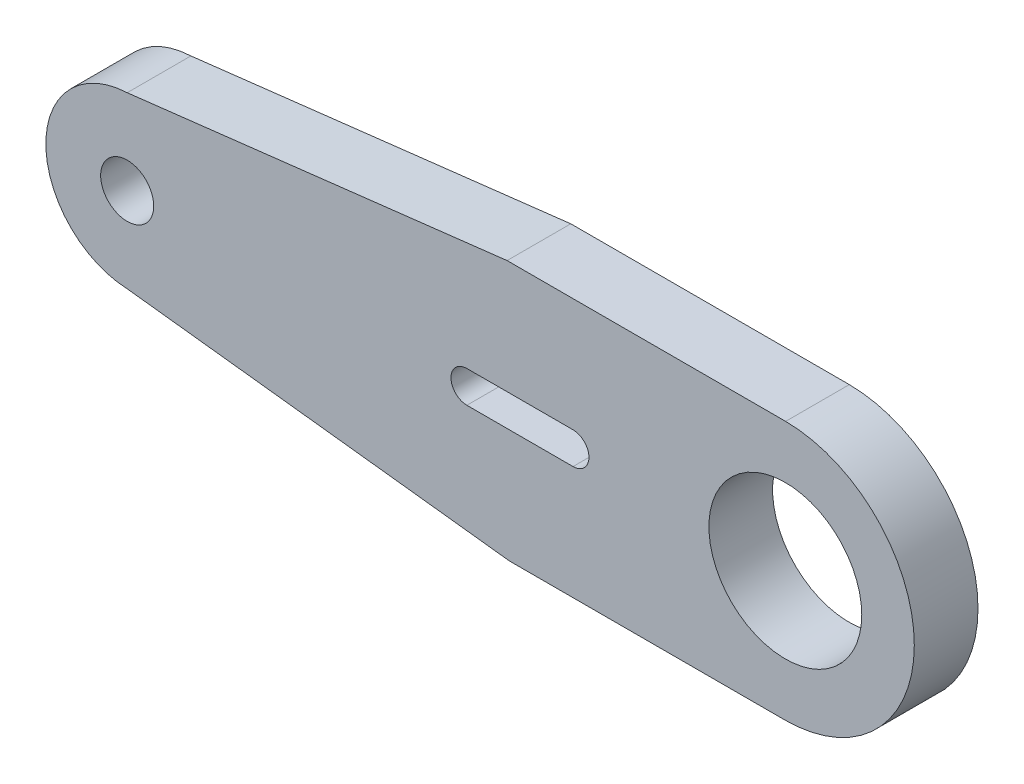
ISO-10303-21;
HEADER;
FILE_DESCRIPTION(('STEP AP214'),'2;1');
FILE_NAME('part.step','',(''),(''),'','','');
FILE_SCHEMA(('AUTOMOTIVE_DESIGN { 1 0 10303 214 1 1 1 1 }'));
ENDSEC;
DATA;
#1=APPLICATION_CONTEXT('core data for automotive mechanical design processes');
#2=APPLICATION_PROTOCOL_DEFINITION('international standard','automotive_design',2000,#1);
#3=PRODUCT_CONTEXT('',#1,'mechanical');
#4=PRODUCT('Part','Part','',(#3));
#5=PRODUCT_RELATED_PRODUCT_CATEGORY('part','',(#4));
#6=PRODUCT_DEFINITION_FORMATION('','',#4);
#7=PRODUCT_DEFINITION_CONTEXT('part definition',#1,'design');
#8=PRODUCT_DEFINITION('design','',#6,#7);
#9=PRODUCT_DEFINITION_SHAPE('','',#8);
#10=(LENGTH_UNIT() NAMED_UNIT(*) SI_UNIT(.MILLI.,.METRE.));
#11=(NAMED_UNIT(*) PLANE_ANGLE_UNIT() SI_UNIT($,.RADIAN.));
#12=(NAMED_UNIT(*) SI_UNIT($,.STERADIAN.) SOLID_ANGLE_UNIT());
#13=UNCERTAINTY_MEASURE_WITH_UNIT(LENGTH_MEASURE(1.E-05),#10,'distance_accuracy_value','');
#14=(GEOMETRIC_REPRESENTATION_CONTEXT(3) GLOBAL_UNCERTAINTY_ASSIGNED_CONTEXT((#13)) GLOBAL_UNIT_ASSIGNED_CONTEXT((#10,
#11,#12)) REPRESENTATION_CONTEXT('',''));
#15=CARTESIAN_POINT('',(0.,0.,0.));
#16=DIRECTION('',(0.,0.,1.));
#17=DIRECTION('',(1.,0.,0.));
#18=AXIS2_PLACEMENT_3D('',#15,#16,#17);
#19=CARTESIAN_POINT('',(266.899778036359,64.0873224153859,3.));
#20=DIRECTION('',(0.,0.,1.));
#21=DIRECTION('',(1.,0.,0.));
#22=AXIS2_PLACEMENT_3D('',#19,#20,#21);
#23=PLANE('',#22);
#24=CARTESIAN_POINT('',(235.924992032314,64.0869474524909,3.));
#25=DIRECTION('',(0.,0.,1.));
#26=DIRECTION('',(1.,0.,0.));
#27=AXIS2_PLACEMENT_3D('',#24,#25,#26);
#28=CIRCLE('',#27,1.25000000000001);
#29=CARTESIAN_POINT('',(237.174992032314,64.0869474524909,3.));
#30=VERTEX_POINT('',#29);
#31=EDGE_CURVE('E138',#30,#30,#28,.T.);
#32=ORIENTED_EDGE('',*,*,#31,.F.);
#33=EDGE_LOOP('',(#32));
#34=FACE_BOUND('',#33,.T.);
#35=CARTESIAN_POINT('',(266.899778036359,64.0873224153859,3.));
#36=DIRECTION('',(0.,0.,1.));
#37=DIRECTION('',(1.,0.,0.));
#38=AXIS2_PLACEMENT_3D('',#35,#36,#37);
#39=CIRCLE('',#38,6.10042666391841);
#40=CARTESIAN_POINT('',(266.924893647648,57.9869474524909,3.));
#41=VERTEX_POINT('',#40);
#42=CARTESIAN_POINT('',(266.940039040523,70.1876162225226,3.));
#43=VERTEX_POINT('',#42);
#44=EDGE_CURVE('E148',#41,#43,#39,.T.);
#45=ORIENTED_EDGE('',*,*,#44,.T.);
#46=DIRECTION('',(-0.999999998701056,-5.09694894962012E-05,0.));
#47=VECTOR('',#46,1.);
#48=CARTESIAN_POINT('',(266.940039040523,70.1876162225226,3.));
#49=LINE('',#48,#47);
#50=CARTESIAN_POINT('',(253.819051615869,70.186947452491,3.));
#51=VERTEX_POINT('',#50);
#52=EDGE_CURVE('E151',#43,#51,#49,.T.);
#53=ORIENTED_EDGE('',*,*,#52,.T.);
#54=DIRECTION('',(-0.993183948949828,-0.116557468865904,0.));
#55=VECTOR('',#54,1.);
#56=CARTESIAN_POINT('',(253.819051615869,70.186947452491,3.));
#57=LINE('',#56,#55);
#58=CARTESIAN_POINT('',(235.924992032314,68.0869474524908,3.));
#59=VERTEX_POINT('',#58);
#60=EDGE_CURVE('E154',#51,#59,#57,.T.);
#61=ORIENTED_EDGE('',*,*,#60,.T.);
#62=CARTESIAN_POINT('',(236.096696802075,64.0869474524906,3.));
#63=DIRECTION('',(0.,0.,1.));
#64=DIRECTION('',(1.,0.,0.));
#65=AXIS2_PLACEMENT_3D('',#62,#63,#64);
#66=CIRCLE('',#65,4.00368361986314);
#67=CARTESIAN_POINT('',(235.924992032314,60.0869474524904,3.));
#68=VERTEX_POINT('',#67);
#69=EDGE_CURVE('E156',#59,#68,#66,.T.);
#70=ORIENTED_EDGE('',*,*,#69,.T.);
#71=DIRECTION('',(0.99326306618432,-0.115881324440666,0.));
#72=VECTOR('',#71,1.);
#73=CARTESIAN_POINT('',(235.924992032314,60.0869474524904,3.));
#74=LINE('',#73,#72);
#75=CARTESIAN_POINT('',(253.924893647648,57.9869474524909,3.));
#76=VERTEX_POINT('',#75);
#77=EDGE_CURVE('E158',#68,#76,#74,.T.);
#78=ORIENTED_EDGE('',*,*,#77,.T.);
#79=DIRECTION('',(1.,0.,0.));
#80=VECTOR('',#79,1.);
#81=CARTESIAN_POINT('',(253.924893647648,57.9869474524909,3.));
#82=LINE('',#81,#80);
#83=EDGE_CURVE('E160',#76,#41,#82,.T.);
#84=ORIENTED_EDGE('',*,*,#83,.T.);
#85=EDGE_LOOP('',(#45,#53,#61,#70,#78,#84));
#86=FACE_BOUND('',#85,.T.);
#87=DIRECTION('',(1.,3.32767569985373E-10,0.));
#88=VECTOR('',#87,1.);
#89=CARTESIAN_POINT('',(256.9249089259,63.3369474562414,3.));
#90=LINE('',#89,#88);
#91=CARTESIAN_POINT('',(251.9249152789,63.3369474545775,3.));
#92=VERTEX_POINT('',#91);
#93=CARTESIAN_POINT('',(256.9249089259,63.3369474562414,3.));
#94=VERTEX_POINT('',#93);
#95=EDGE_CURVE('E117',#92,#94,#90,.T.);
#96=ORIENTED_EDGE('',*,*,#95,.F.);
#97=CARTESIAN_POINT('',(251.9249152789,64.086947452491,3.));
#98=DIRECTION('',(0.,0.,1.));
#99=DIRECTION('',(1.,0.,0.));
#100=AXIS2_PLACEMENT_3D('',#97,#98,#99);
#101=CIRCLE('',#100,0.749999997913448);
#102=CARTESIAN_POINT('',(251.9249152789,64.8369474504044,3.));
#103=VERTEX_POINT('',#102);
#104=EDGE_CURVE('E109',#103,#92,#101,.T.);
#105=ORIENTED_EDGE('',*,*,#104,.F.);
#106=DIRECTION('',(-1.,0.,0.));
#107=VECTOR('',#106,1.);
#108=CARTESIAN_POINT('',(251.9249152789,64.8369474504044,3.));
#109=LINE('',#108,#107);
#110=CARTESIAN_POINT('',(256.924908925901,64.8369474504044,3.));
#111=VERTEX_POINT('',#110);
#112=EDGE_CURVE('E132',#111,#103,#109,.T.);
#113=ORIENTED_EDGE('',*,*,#112,.F.);
#114=CARTESIAN_POINT('',(256.9249089259,64.0869474533229,3.));
#115=DIRECTION('',(0.,0.,1.));
#116=DIRECTION('',(1.,0.,0.));
#117=AXIS2_PLACEMENT_3D('',#114,#115,#116);
#118=CIRCLE('',#117,0.74999999708153);
#119=EDGE_CURVE('E130',#94,#111,#118,.T.);
#120=ORIENTED_EDGE('',*,*,#119,.F.);
#121=EDGE_LOOP('',(#96,#105,#113,#120));
#122=FACE_BOUND('',#121,.T.);
#123=CARTESIAN_POINT('',(266.924883927151,64.0869974524909,3.));
#124=DIRECTION('',(0.,0.,1.));
#125=DIRECTION('',(1.,0.,0.));
#126=AXIS2_PLACEMENT_3D('',#123,#124,#125);
#127=CIRCLE('',#126,3.60000000000001);
#128=CARTESIAN_POINT('',(270.524883927151,64.0869974524909,3.));
#129=VERTEX_POINT('',#128);
#130=EDGE_CURVE('E254',#129,#129,#127,.T.);
#131=ORIENTED_EDGE('',*,*,#130,.F.);
#132=EDGE_LOOP('',(#131));
#133=FACE_BOUND('',#132,.T.);
#134=ADVANCED_FACE('F32',(#34,#86,#122,#133),#23,.T.);
#135=CARTESIAN_POINT('',(266.899778036359,64.0873224153859,0.));
#136=DIRECTION('',(0.,0.,1.));
#137=DIRECTION('',(1.,0.,0.));
#138=AXIS2_PLACEMENT_3D('',#135,#136,#137);
#139=PLANE('',#138);
#140=CARTESIAN_POINT('',(266.899778036359,64.0873224153859,0.));
#141=DIRECTION('',(0.,0.,1.));
#142=DIRECTION('',(1.,0.,0.));
#143=AXIS2_PLACEMENT_3D('',#140,#141,#142);
#144=CIRCLE('',#143,6.10042666391841);
#145=CARTESIAN_POINT('',(266.924893647648,57.9869474524909,0.));
#146=VERTEX_POINT('',#145);
#147=CARTESIAN_POINT('',(266.940039040523,70.1876162225226,0.));
#148=VERTEX_POINT('',#147);
#149=EDGE_CURVE('E125',#146,#148,#144,.T.);
#150=ORIENTED_EDGE('',*,*,#149,.F.);
#151=DIRECTION('',(1.,0.,0.));
#152=VECTOR('',#151,1.);
#153=CARTESIAN_POINT('',(253.924893647648,57.9869474524909,0.));
#154=LINE('',#153,#152);
#155=CARTESIAN_POINT('',(253.924893647648,57.9869474524909,0.));
#156=VERTEX_POINT('',#155);
#157=EDGE_CURVE('E152',#156,#146,#154,.T.);
#158=ORIENTED_EDGE('',*,*,#157,.F.);
#159=DIRECTION('',(0.99326306618432,-0.115881324440666,0.));
#160=VECTOR('',#159,1.);
#161=CARTESIAN_POINT('',(235.924992032314,60.0869474524904,0.));
#162=LINE('',#161,#160);
#163=CARTESIAN_POINT('',(235.924992032314,60.0869474524904,0.));
#164=VERTEX_POINT('',#163);
#165=EDGE_CURVE('E171',#164,#156,#162,.T.);
#166=ORIENTED_EDGE('',*,*,#165,.F.);
#167=CARTESIAN_POINT('',(236.096696802075,64.0869474524906,0.));
#168=DIRECTION('',(0.,0.,1.));
#169=DIRECTION('',(1.,0.,0.));
#170=AXIS2_PLACEMENT_3D('',#167,#168,#169);
#171=CIRCLE('',#170,4.00368361986314);
#172=CARTESIAN_POINT('',(235.924992032314,68.0869474524908,0.));
#173=VERTEX_POINT('',#172);
#174=EDGE_CURVE('E169',#173,#164,#171,.T.);
#175=ORIENTED_EDGE('',*,*,#174,.F.);
#176=DIRECTION('',(-0.993183948949828,-0.116557468865904,0.));
#177=VECTOR('',#176,1.);
#178=CARTESIAN_POINT('',(253.819051615869,70.186947452491,0.));
#179=LINE('',#178,#177);
#180=CARTESIAN_POINT('',(253.819051615869,70.186947452491,0.));
#181=VERTEX_POINT('',#180);
#182=EDGE_CURVE('E167',#181,#173,#179,.T.);
#183=ORIENTED_EDGE('',*,*,#182,.F.);
#184=DIRECTION('',(-0.999999998701056,-5.09694894962012E-05,0.));
#185=VECTOR('',#184,1.);
#186=CARTESIAN_POINT('',(266.940039040523,70.1876162225226,0.));
#187=LINE('',#186,#185);
#188=EDGE_CURVE('E165',#148,#181,#187,.T.);
#189=ORIENTED_EDGE('',*,*,#188,.F.);
#190=EDGE_LOOP('',(#150,#158,#166,#175,#183,#189));
#191=FACE_BOUND('',#190,.T.);
#192=CARTESIAN_POINT('',(251.9249152789,64.086947452491,0.));
#193=DIRECTION('',(0.,0.,1.));
#194=DIRECTION('',(1.,0.,0.));
#195=AXIS2_PLACEMENT_3D('',#192,#193,#194);
#196=CIRCLE('',#195,0.749999997913448);
#197=CARTESIAN_POINT('',(251.9249152789,64.8369474504044,0.));
#198=VERTEX_POINT('',#197);
#199=CARTESIAN_POINT('',(251.9249152789,63.3369474545775,0.));
#200=VERTEX_POINT('',#199);
#201=EDGE_CURVE('E55',#198,#200,#196,.T.);
#202=ORIENTED_EDGE('',*,*,#201,.T.);
#203=DIRECTION('',(1.,3.32767569985373E-10,0.));
#204=VECTOR('',#203,1.);
#205=CARTESIAN_POINT('',(256.9249089259,63.3369474562414,0.));
#206=LINE('',#205,#204);
#207=CARTESIAN_POINT('',(256.9249089259,63.3369474562414,0.));
#208=VERTEX_POINT('',#207);
#209=EDGE_CURVE('E124',#200,#208,#206,.T.);
#210=ORIENTED_EDGE('',*,*,#209,.T.);
#211=CARTESIAN_POINT('',(256.9249089259,64.0869474533229,0.));
#212=DIRECTION('',(0.,0.,1.));
#213=DIRECTION('',(1.,0.,0.));
#214=AXIS2_PLACEMENT_3D('',#211,#212,#213);
#215=CIRCLE('',#214,0.74999999708153);
#216=CARTESIAN_POINT('',(256.924908925901,64.8369474504044,0.));
#217=VERTEX_POINT('',#216);
#218=EDGE_CURVE('E140',#208,#217,#215,.T.);
#219=ORIENTED_EDGE('',*,*,#218,.T.);
#220=DIRECTION('',(-1.,0.,0.));
#221=VECTOR('',#220,1.);
#222=CARTESIAN_POINT('',(251.9249152789,64.8369474504044,0.));
#223=LINE('',#222,#221);
#224=EDGE_CURVE('E118',#217,#198,#223,.T.);
#225=ORIENTED_EDGE('',*,*,#224,.T.);
#226=EDGE_LOOP('',(#202,#210,#219,#225));
#227=FACE_BOUND('',#226,.T.);
#228=CARTESIAN_POINT('',(235.924992032314,64.0869474524909,0.));
#229=DIRECTION('',(0.,0.,1.));
#230=DIRECTION('',(1.,0.,0.));
#231=AXIS2_PLACEMENT_3D('',#228,#229,#230);
#232=CIRCLE('',#231,1.25000000000001);
#233=CARTESIAN_POINT('',(237.174992032314,64.0869474524909,0.));
#234=VERTEX_POINT('',#233);
#235=EDGE_CURVE('E260',#234,#234,#232,.T.);
#236=ORIENTED_EDGE('',*,*,#235,.T.);
#237=EDGE_LOOP('',(#236));
#238=FACE_BOUND('',#237,.T.);
#239=CARTESIAN_POINT('',(266.924883927151,64.0869974524909,0.));
#240=DIRECTION('',(0.,0.,1.));
#241=DIRECTION('',(1.,0.,0.));
#242=AXIS2_PLACEMENT_3D('',#239,#240,#241);
#243=CIRCLE('',#242,3.60000000000001);
#244=CARTESIAN_POINT('',(270.524883927151,64.0869974524909,0.));
#245=VERTEX_POINT('',#244);
#246=EDGE_CURVE('E257',#245,#245,#243,.T.);
#247=ORIENTED_EDGE('',*,*,#246,.T.);
#248=EDGE_LOOP('',(#247));
#249=FACE_BOUND('',#248,.T.);
#250=ADVANCED_FACE('F195',(#191,#227,#238,#249),#139,.F.);
#251=CARTESIAN_POINT('',(266.899778036359,64.0873224153859,3.));
#252=DIRECTION('',(0.,0.,-1.));
#253=DIRECTION('',(-1.,0.,0.));
#254=AXIS2_PLACEMENT_3D('',#251,#252,#253);
#255=CYLINDRICAL_SURFACE('',#254,6.10042666391841);
#256=ORIENTED_EDGE('',*,*,#149,.T.);
#257=DIRECTION('',(0.,0.,-1.));
#258=VECTOR('',#257,1.);
#259=CARTESIAN_POINT('',(266.940039040523,70.1876162225226,3.));
#260=LINE('',#259,#258);
#261=EDGE_CURVE('E11',#43,#148,#260,.T.);
#262=ORIENTED_EDGE('',*,*,#261,.F.);
#263=ORIENTED_EDGE('',*,*,#44,.F.);
#264=DIRECTION('',(0.,0.,-1.));
#265=VECTOR('',#264,1.);
#266=CARTESIAN_POINT('',(266.924893647648,57.9869474524909,3.));
#267=LINE('',#266,#265);
#268=EDGE_CURVE('E162',#41,#146,#267,.T.);
#269=ORIENTED_EDGE('',*,*,#268,.T.);
#270=EDGE_LOOP('',(#256,#262,#263,#269));
#271=FACE_BOUND('',#270,.T.);
#272=ADVANCED_FACE('F34',(#271),#255,.T.);
#273=CARTESIAN_POINT('',(266.940039040523,70.1876162225226,3.));
#274=DIRECTION('',(5.09694894962012E-05,-0.999999998701055,0.));
#275=DIRECTION('',(0.999999998701056,5.09694894962012E-05,0.));
#276=AXIS2_PLACEMENT_3D('',#273,#274,#275);
#277=PLANE('',#276);
#278=ORIENTED_EDGE('',*,*,#188,.T.);
#279=DIRECTION('',(0.,0.,-1.));
#280=VECTOR('',#279,1.);
#281=CARTESIAN_POINT('',(253.819051615869,70.186947452491,3.));
#282=LINE('',#281,#280);
#283=EDGE_CURVE('E40',#51,#181,#282,.T.);
#284=ORIENTED_EDGE('',*,*,#283,.F.);
#285=ORIENTED_EDGE('',*,*,#52,.F.);
#286=ORIENTED_EDGE('',*,*,#261,.T.);
#287=EDGE_LOOP('',(#278,#284,#285,#286));
#288=FACE_BOUND('',#287,.T.);
#289=ADVANCED_FACE('F212',(#288),#277,.F.);
#290=CARTESIAN_POINT('',(253.819051615869,70.186947452491,3.));
#291=DIRECTION('',(0.116557468865904,-0.993183948949828,0.));
#292=DIRECTION('',(0.993183948949828,0.116557468865904,0.));
#293=AXIS2_PLACEMENT_3D('',#290,#291,#292);
#294=PLANE('',#293);
#295=ORIENTED_EDGE('',*,*,#182,.T.);
#296=DIRECTION('',(0.,0.,-1.));
#297=VECTOR('',#296,1.);
#298=CARTESIAN_POINT('',(235.924992032314,68.0869474524908,3.));
#299=LINE('',#298,#297);
#300=EDGE_CURVE('E182',#59,#173,#299,.T.);
#301=ORIENTED_EDGE('',*,*,#300,.F.);
#302=ORIENTED_EDGE('',*,*,#60,.F.);
#303=ORIENTED_EDGE('',*,*,#283,.T.);
#304=EDGE_LOOP('',(#295,#301,#302,#303));
#305=FACE_BOUND('',#304,.T.);
#306=ADVANCED_FACE('F189',(#305),#294,.F.);
#307=CARTESIAN_POINT('',(236.096696802075,64.0869474524906,3.));
#308=DIRECTION('',(0.,0.,-1.));
#309=DIRECTION('',(-1.,0.,0.));
#310=AXIS2_PLACEMENT_3D('',#307,#308,#309);
#311=CYLINDRICAL_SURFACE('',#310,4.00368361986314);
#312=ORIENTED_EDGE('',*,*,#174,.T.);
#313=DIRECTION('',(0.,0.,-1.));
#314=VECTOR('',#313,1.);
#315=CARTESIAN_POINT('',(235.924992032314,60.0869474524904,3.));
#316=LINE('',#315,#314);
#317=EDGE_CURVE('E179',#68,#164,#316,.T.);
#318=ORIENTED_EDGE('',*,*,#317,.F.);
#319=ORIENTED_EDGE('',*,*,#69,.F.);
#320=ORIENTED_EDGE('',*,*,#300,.T.);
#321=EDGE_LOOP('',(#312,#318,#319,#320));
#322=FACE_BOUND('',#321,.T.);
#323=ADVANCED_FACE('F201',(#322),#311,.T.);
#324=CARTESIAN_POINT('',(235.924992032314,60.0869474524904,3.));
#325=DIRECTION('',(0.115881324440666,0.99326306618432,0.));
#326=DIRECTION('',(-0.99326306618432,0.115881324440666,0.));
#327=AXIS2_PLACEMENT_3D('',#324,#325,#326);
#328=PLANE('',#327);
#329=ORIENTED_EDGE('',*,*,#165,.T.);
#330=DIRECTION('',(0.,0.,-1.));
#331=VECTOR('',#330,1.);
#332=CARTESIAN_POINT('',(253.924893647648,57.9869474524909,3.));
#333=LINE('',#332,#331);
#334=EDGE_CURVE('E176',#76,#156,#333,.T.);
#335=ORIENTED_EDGE('',*,*,#334,.F.);
#336=ORIENTED_EDGE('',*,*,#77,.F.);
#337=ORIENTED_EDGE('',*,*,#317,.T.);
#338=EDGE_LOOP('',(#329,#335,#336,#337));
#339=FACE_BOUND('',#338,.T.);
#340=ADVANCED_FACE('F205',(#339),#328,.F.);
#341=CARTESIAN_POINT('',(253.924893647648,57.9869474524909,3.));
#342=DIRECTION('',(0.,1.,0.));
#343=DIRECTION('',(-1.,0.,0.));
#344=AXIS2_PLACEMENT_3D('',#341,#342,#343);
#345=PLANE('',#344);
#346=ORIENTED_EDGE('',*,*,#157,.T.);
#347=ORIENTED_EDGE('',*,*,#268,.F.);
#348=ORIENTED_EDGE('',*,*,#83,.F.);
#349=ORIENTED_EDGE('',*,*,#334,.T.);
#350=EDGE_LOOP('',(#346,#347,#348,#349));
#351=FACE_BOUND('',#350,.T.);
#352=ADVANCED_FACE('F215',(#351),#345,.F.);
#353=CARTESIAN_POINT('',(251.9249152789,64.086947452491,3.));
#354=DIRECTION('',(0.,0.,-1.));
#355=DIRECTION('',(-1.,0.,0.));
#356=AXIS2_PLACEMENT_3D('',#353,#354,#355);
#357=CYLINDRICAL_SURFACE('',#356,0.749999997913448);
#358=ORIENTED_EDGE('',*,*,#201,.F.);
#359=DIRECTION('',(0.,0.,-1.));
#360=VECTOR('',#359,1.);
#361=CARTESIAN_POINT('',(251.9249152789,64.8369474504044,3.));
#362=LINE('',#361,#360);
#363=EDGE_CURVE('E113',#103,#198,#362,.T.);
#364=ORIENTED_EDGE('',*,*,#363,.F.);
#365=ORIENTED_EDGE('',*,*,#104,.T.);
#366=DIRECTION('',(0.,0.,-1.));
#367=VECTOR('',#366,1.);
#368=CARTESIAN_POINT('',(251.9249152789,63.3369474545775,3.));
#369=LINE('',#368,#367);
#370=EDGE_CURVE('E112',#92,#200,#369,.T.);
#371=ORIENTED_EDGE('',*,*,#370,.T.);
#372=EDGE_LOOP('',(#358,#364,#365,#371));
#373=FACE_BOUND('',#372,.T.);
#374=ADVANCED_FACE('F111',(#373),#357,.F.);
#375=CARTESIAN_POINT('',(256.9249089259,63.3369474562414,3.));
#376=DIRECTION('',(-3.32767569985373E-10,1.,0.));
#377=DIRECTION('',(-1.,-3.32767569985373E-10,0.));
#378=AXIS2_PLACEMENT_3D('',#375,#376,#377);
#379=PLANE('',#378);
#380=ORIENTED_EDGE('',*,*,#209,.F.);
#381=ORIENTED_EDGE('',*,*,#370,.F.);
#382=ORIENTED_EDGE('',*,*,#95,.T.);
#383=DIRECTION('',(0.,0.,-1.));
#384=VECTOR('',#383,1.);
#385=CARTESIAN_POINT('',(256.9249089259,63.3369474562414,3.));
#386=LINE('',#385,#384);
#387=EDGE_CURVE('E126',#94,#208,#386,.T.);
#388=ORIENTED_EDGE('',*,*,#387,.T.);
#389=EDGE_LOOP('',(#380,#381,#382,#388));
#390=FACE_BOUND('',#389,.T.);
#391=ADVANCED_FACE('F121',(#390),#379,.T.);
#392=CARTESIAN_POINT('',(256.9249089259,64.0869474533229,3.));
#393=DIRECTION('',(0.,0.,-1.));
#394=DIRECTION('',(-1.,0.,0.));
#395=AXIS2_PLACEMENT_3D('',#392,#393,#394);
#396=CYLINDRICAL_SURFACE('',#395,0.74999999708153);
#397=ORIENTED_EDGE('',*,*,#218,.F.);
#398=ORIENTED_EDGE('',*,*,#387,.F.);
#399=ORIENTED_EDGE('',*,*,#119,.T.);
#400=DIRECTION('',(0.,0.,-1.));
#401=VECTOR('',#400,1.);
#402=CARTESIAN_POINT('',(256.924908925901,64.8369474504044,3.));
#403=LINE('',#402,#401);
#404=EDGE_CURVE('E47',#111,#217,#403,.T.);
#405=ORIENTED_EDGE('',*,*,#404,.T.);
#406=EDGE_LOOP('',(#397,#398,#399,#405));
#407=FACE_BOUND('',#406,.T.);
#408=ADVANCED_FACE('F235',(#407),#396,.F.);
#409=CARTESIAN_POINT('',(251.9249152789,64.8369474504044,3.));
#410=DIRECTION('',(0.,-1.,0.));
#411=DIRECTION('',(0.,0.,-1.));
#412=AXIS2_PLACEMENT_3D('',#409,#410,#411);
#413=PLANE('',#412);
#414=ORIENTED_EDGE('',*,*,#224,.F.);
#415=ORIENTED_EDGE('',*,*,#404,.F.);
#416=ORIENTED_EDGE('',*,*,#112,.T.);
#417=ORIENTED_EDGE('',*,*,#363,.T.);
#418=EDGE_LOOP('',(#414,#415,#416,#417));
#419=FACE_BOUND('',#418,.T.);
#420=ADVANCED_FACE('F238',(#419),#413,.T.);
#421=CARTESIAN_POINT('',(235.924992032314,64.0869474524909,3.));
#422=DIRECTION('',(0.,0.,-1.));
#423=DIRECTION('',(-1.,0.,0.));
#424=AXIS2_PLACEMENT_3D('',#421,#422,#423);
#425=CYLINDRICAL_SURFACE('',#424,1.25000000000001);
#426=ORIENTED_EDGE('',*,*,#31,.T.);
#427=EDGE_LOOP('',(#426));
#428=FACE_BOUND('',#427,.T.);
#429=ORIENTED_EDGE('',*,*,#235,.F.);
#430=EDGE_LOOP('',(#429));
#431=FACE_BOUND('',#430,.T.);
#432=ADVANCED_FACE('F242',(#428,#431),#425,.F.);
#433=CARTESIAN_POINT('',(266.924883927151,64.0869974524909,3.));
#434=DIRECTION('',(0.,0.,-1.));
#435=DIRECTION('',(-1.,0.,0.));
#436=AXIS2_PLACEMENT_3D('',#433,#434,#435);
#437=CYLINDRICAL_SURFACE('',#436,3.60000000000001);
#438=ORIENTED_EDGE('',*,*,#130,.T.);
#439=EDGE_LOOP('',(#438));
#440=FACE_BOUND('',#439,.T.);
#441=ORIENTED_EDGE('',*,*,#246,.F.);
#442=EDGE_LOOP('',(#441));
#443=FACE_BOUND('',#442,.T.);
#444=ADVANCED_FACE('F245',(#440,#443),#437,.F.);
#445=CLOSED_SHELL('',(#134,#250,#272,#289,#306,#323,#340,#352,#374,#391,#408,#420,#432,#444));
#446=MANIFOLD_SOLID_BREP('B2',#445);
#447=ADVANCED_BREP_SHAPE_REPRESENTATION('',(#18,#446),#14);
#448=SHAPE_DEFINITION_REPRESENTATION(#9,#447);
ENDSEC;
END-ISO-10303-21;
